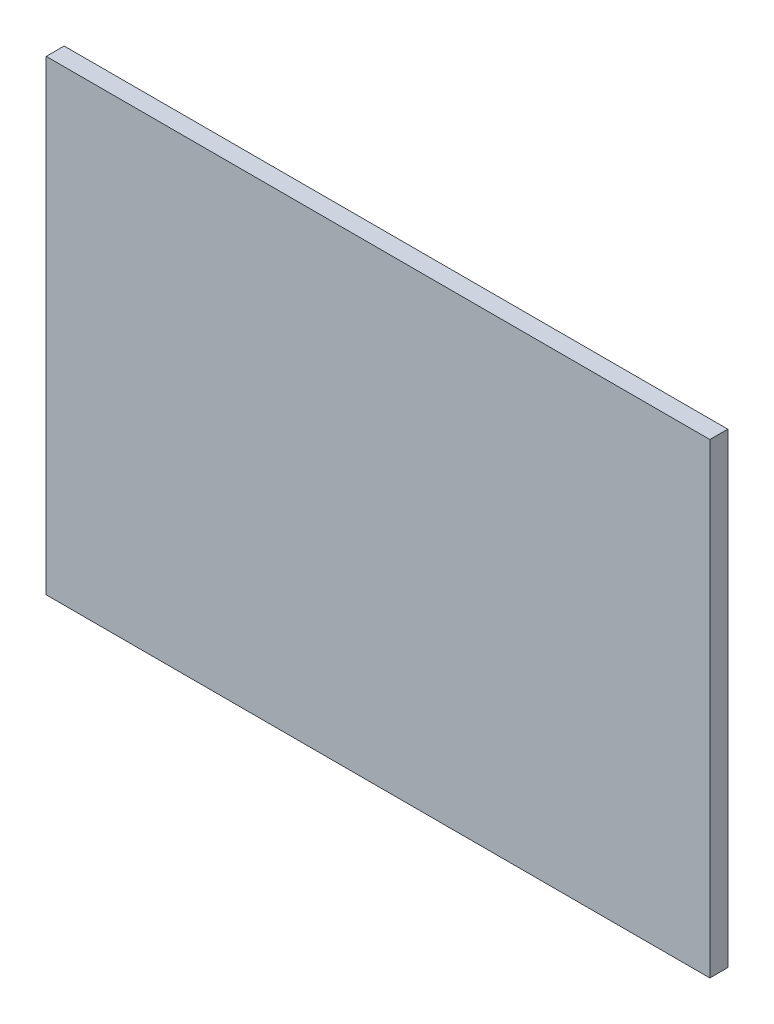
ISO-10303-21;
HEADER;
FILE_DESCRIPTION(('STEP AP214'),'2;1');
FILE_NAME('part.step','',(''),(''),'','','');
FILE_SCHEMA(('AUTOMOTIVE_DESIGN { 1 0 10303 214 1 1 1 1 }'));
ENDSEC;
DATA;
#1=APPLICATION_CONTEXT('core data for automotive mechanical design processes');
#2=APPLICATION_PROTOCOL_DEFINITION('international standard','automotive_design',2000,#1);
#3=PRODUCT_CONTEXT('',#1,'mechanical');
#4=PRODUCT('Part','Part','',(#3));
#5=PRODUCT_RELATED_PRODUCT_CATEGORY('part','',(#4));
#6=PRODUCT_DEFINITION_FORMATION('','',#4);
#7=PRODUCT_DEFINITION_CONTEXT('part definition',#1,'design');
#8=PRODUCT_DEFINITION('design','',#6,#7);
#9=PRODUCT_DEFINITION_SHAPE('','',#8);
#10=(LENGTH_UNIT() NAMED_UNIT(*) SI_UNIT(.MILLI.,.METRE.));
#11=(NAMED_UNIT(*) PLANE_ANGLE_UNIT() SI_UNIT($,.RADIAN.));
#12=(NAMED_UNIT(*) SI_UNIT($,.STERADIAN.) SOLID_ANGLE_UNIT());
#13=UNCERTAINTY_MEASURE_WITH_UNIT(LENGTH_MEASURE(1.E-05),#10,'distance_accuracy_value','');
#14=(GEOMETRIC_REPRESENTATION_CONTEXT(3) GLOBAL_UNCERTAINTY_ASSIGNED_CONTEXT((#13)) GLOBAL_UNIT_ASSIGNED_CONTEXT((#10,
#11,#12)) REPRESENTATION_CONTEXT('',''));
#15=CARTESIAN_POINT('',(0.,0.,0.));
#16=DIRECTION('',(0.,0.,1.));
#17=DIRECTION('',(1.,0.,0.));
#18=AXIS2_PLACEMENT_3D('',#15,#16,#17);
#19=CARTESIAN_POINT('',(37.,-26.,2.));
#20=DIRECTION('',(-1.,0.,0.));
#21=DIRECTION('',(0.,0.,1.));
#22=AXIS2_PLACEMENT_3D('',#19,#20,#21);
#23=PLANE('',#22);
#24=DIRECTION('',(0.,1.,0.));
#25=VECTOR('',#24,1.);
#26=CARTESIAN_POINT('',(37.,-26.,0.));
#27=LINE('',#26,#25);
#28=CARTESIAN_POINT('',(37.,-26.,0.));
#29=VERTEX_POINT('',#28);
#30=CARTESIAN_POINT('',(37.,26.,0.));
#31=VERTEX_POINT('',#30);
#32=EDGE_CURVE('E109',#29,#31,#27,.T.);
#33=ORIENTED_EDGE('',*,*,#32,.T.);
#34=DIRECTION('',(0.,0.,-1.));
#35=VECTOR('',#34,1.);
#36=CARTESIAN_POINT('',(37.,26.,2.));
#37=LINE('',#36,#35);
#38=CARTESIAN_POINT('',(37.,26.,2.));
#39=VERTEX_POINT('',#38);
#40=EDGE_CURVE('E11',#39,#31,#37,.T.);
#41=ORIENTED_EDGE('',*,*,#40,.F.);
#42=DIRECTION('',(0.,1.,0.));
#43=VECTOR('',#42,1.);
#44=CARTESIAN_POINT('',(37.,-26.,2.));
#45=LINE('',#44,#43);
#46=CARTESIAN_POINT('',(37.,-26.,2.));
#47=VERTEX_POINT('',#46);
#48=EDGE_CURVE('E93',#47,#39,#45,.T.);
#49=ORIENTED_EDGE('',*,*,#48,.F.);
#50=DIRECTION('',(0.,0.,-1.));
#51=VECTOR('',#50,1.);
#52=CARTESIAN_POINT('',(37.,-26.,2.));
#53=LINE('',#52,#51);
#54=EDGE_CURVE('E105',#47,#29,#53,.T.);
#55=ORIENTED_EDGE('',*,*,#54,.T.);
#56=EDGE_LOOP('',(#33,#41,#49,#55));
#57=FACE_BOUND('',#56,.T.);
#58=ADVANCED_FACE('F41',(#57),#23,.F.);
#59=CARTESIAN_POINT('',(-37.,26.,2.));
#60=DIRECTION('',(0.,-1.,0.));
#61=DIRECTION('',(0.,0.,-1.));
#62=AXIS2_PLACEMENT_3D('',#59,#60,#61);
#63=PLANE('',#62);
#64=DIRECTION('',(-1.,0.,0.));
#65=VECTOR('',#64,1.);
#66=CARTESIAN_POINT('',(-37.,26.,0.));
#67=LINE('',#66,#65);
#68=CARTESIAN_POINT('',(-37.,26.,0.));
#69=VERTEX_POINT('',#68);
#70=EDGE_CURVE('E98',#31,#69,#67,.T.);
#71=ORIENTED_EDGE('',*,*,#70,.T.);
#72=DIRECTION('',(0.,0.,-1.));
#73=VECTOR('',#72,1.);
#74=CARTESIAN_POINT('',(-37.,26.,2.));
#75=LINE('',#74,#73);
#76=CARTESIAN_POINT('',(-37.,26.,2.));
#77=VERTEX_POINT('',#76);
#78=EDGE_CURVE('E50',#77,#69,#75,.T.);
#79=ORIENTED_EDGE('',*,*,#78,.F.);
#80=DIRECTION('',(-1.,0.,0.));
#81=VECTOR('',#80,1.);
#82=CARTESIAN_POINT('',(-37.,26.,2.));
#83=LINE('',#82,#81);
#84=EDGE_CURVE('E88',#39,#77,#83,.T.);
#85=ORIENTED_EDGE('',*,*,#84,.F.);
#86=ORIENTED_EDGE('',*,*,#40,.T.);
#87=EDGE_LOOP('',(#71,#79,#85,#86));
#88=FACE_BOUND('',#87,.T.);
#89=ADVANCED_FACE('F97',(#88),#63,.F.);
#90=CARTESIAN_POINT('',(-37.,-26.,2.));
#91=DIRECTION('',(1.,0.,0.));
#92=DIRECTION('',(0.,0.,-1.));
#93=AXIS2_PLACEMENT_3D('',#90,#91,#92);
#94=PLANE('',#93);
#95=DIRECTION('',(0.,-1.,0.));
#96=VECTOR('',#95,1.);
#97=CARTESIAN_POINT('',(-37.,-26.,0.));
#98=LINE('',#97,#96);
#99=CARTESIAN_POINT('',(-37.,-26.,0.));
#100=VERTEX_POINT('',#99);
#101=EDGE_CURVE('E75',#69,#100,#98,.T.);
#102=ORIENTED_EDGE('',*,*,#101,.T.);
#103=DIRECTION('',(0.,0.,-1.));
#104=VECTOR('',#103,1.);
#105=CARTESIAN_POINT('',(-37.,-26.,2.));
#106=LINE('',#105,#104);
#107=CARTESIAN_POINT('',(-37.,-26.,2.));
#108=VERTEX_POINT('',#107);
#109=EDGE_CURVE('E100',#108,#100,#106,.T.);
#110=ORIENTED_EDGE('',*,*,#109,.F.);
#111=DIRECTION('',(0.,-1.,0.));
#112=VECTOR('',#111,1.);
#113=CARTESIAN_POINT('',(-37.,-26.,2.));
#114=LINE('',#113,#112);
#115=EDGE_CURVE('E91',#77,#108,#114,.T.);
#116=ORIENTED_EDGE('',*,*,#115,.F.);
#117=ORIENTED_EDGE('',*,*,#78,.T.);
#118=EDGE_LOOP('',(#102,#110,#116,#117));
#119=FACE_BOUND('',#118,.T.);
#120=ADVANCED_FACE('F101',(#119),#94,.F.);
#121=CARTESIAN_POINT('',(-37.,-26.,2.));
#122=DIRECTION('',(0.,1.,0.));
#123=DIRECTION('',(0.,0.,1.));
#124=AXIS2_PLACEMENT_3D('',#121,#122,#123);
#125=PLANE('',#124);
#126=DIRECTION('',(1.,0.,0.));
#127=VECTOR('',#126,1.);
#128=CARTESIAN_POINT('',(-37.,-26.,0.));
#129=LINE('',#128,#127);
#130=EDGE_CURVE('E81',#100,#29,#129,.T.);
#131=ORIENTED_EDGE('',*,*,#130,.T.);
#132=ORIENTED_EDGE('',*,*,#54,.F.);
#133=DIRECTION('',(1.,0.,0.));
#134=VECTOR('',#133,1.);
#135=CARTESIAN_POINT('',(-37.,-26.,2.));
#136=LINE('',#135,#134);
#137=EDGE_CURVE('E58',#108,#47,#136,.T.);
#138=ORIENTED_EDGE('',*,*,#137,.F.);
#139=ORIENTED_EDGE('',*,*,#109,.T.);
#140=EDGE_LOOP('',(#131,#132,#138,#139));
#141=FACE_BOUND('',#140,.T.);
#142=ADVANCED_FACE('F122',(#141),#125,.F.);
#143=CARTESIAN_POINT('',(0.,0.,2.));
#144=DIRECTION('',(0.,0.,-1.));
#145=DIRECTION('',(-1.,0.,0.));
#146=AXIS2_PLACEMENT_3D('',#143,#144,#145);
#147=PLANE('',#146);
#148=ORIENTED_EDGE('',*,*,#48,.T.);
#149=ORIENTED_EDGE('',*,*,#84,.T.);
#150=ORIENTED_EDGE('',*,*,#115,.T.);
#151=ORIENTED_EDGE('',*,*,#137,.T.);
#152=EDGE_LOOP('',(#148,#149,#150,#151));
#153=FACE_BOUND('',#152,.T.);
#154=ADVANCED_FACE('F89',(#153),#147,.F.);
#155=CARTESIAN_POINT('',(0.,0.,0.));
#156=DIRECTION('',(0.,0.,-1.));
#157=DIRECTION('',(-1.,0.,0.));
#158=AXIS2_PLACEMENT_3D('',#155,#156,#157);
#159=PLANE('',#158);
#160=ORIENTED_EDGE('',*,*,#32,.F.);
#161=ORIENTED_EDGE('',*,*,#130,.F.);
#162=ORIENTED_EDGE('',*,*,#101,.F.);
#163=ORIENTED_EDGE('',*,*,#70,.F.);
#164=EDGE_LOOP('',(#160,#161,#162,#163));
#165=FACE_BOUND('',#164,.T.);
#166=ADVANCED_FACE('F125',(#165),#159,.T.);
#167=CLOSED_SHELL('',(#58,#89,#120,#142,#154,#166));
#168=MANIFOLD_SOLID_BREP('B2',#167);
#169=ADVANCED_BREP_SHAPE_REPRESENTATION('',(#18,#168),#14);
#170=SHAPE_DEFINITION_REPRESENTATION(#9,#169);
ENDSEC;
END-ISO-10303-21;
